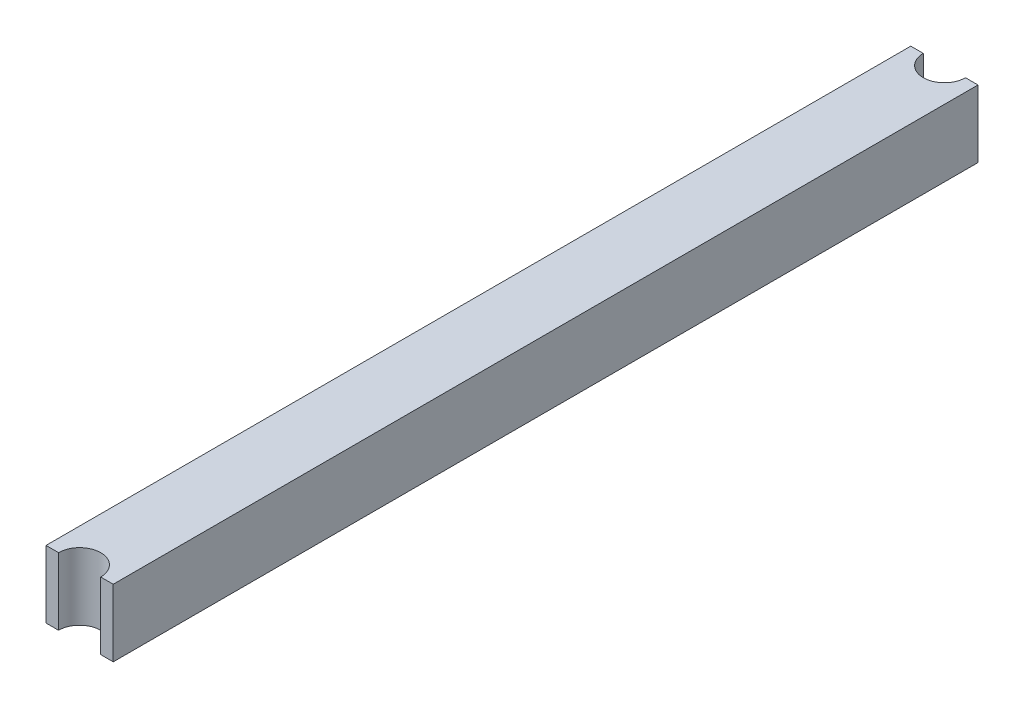
ISO-10303-21;
HEADER;
FILE_DESCRIPTION(('STEP AP214'),'2;1');
FILE_NAME('part.step','',(''),(''),'','','');
FILE_SCHEMA(('AUTOMOTIVE_DESIGN { 1 0 10303 214 1 1 1 1 }'));
ENDSEC;
DATA;
#1=APPLICATION_CONTEXT('core data for automotive mechanical design processes');
#2=APPLICATION_PROTOCOL_DEFINITION('international standard','automotive_design',2000,#1);
#3=PRODUCT_CONTEXT('',#1,'mechanical');
#4=PRODUCT('Part','Part','',(#3));
#5=PRODUCT_RELATED_PRODUCT_CATEGORY('part','',(#4));
#6=PRODUCT_DEFINITION_FORMATION('','',#4);
#7=PRODUCT_DEFINITION_CONTEXT('part definition',#1,'design');
#8=PRODUCT_DEFINITION('design','',#6,#7);
#9=PRODUCT_DEFINITION_SHAPE('','',#8);
#10=(LENGTH_UNIT() NAMED_UNIT(*) SI_UNIT(.MILLI.,.METRE.));
#11=(NAMED_UNIT(*) PLANE_ANGLE_UNIT() SI_UNIT($,.RADIAN.));
#12=(NAMED_UNIT(*) SI_UNIT($,.STERADIAN.) SOLID_ANGLE_UNIT());
#13=UNCERTAINTY_MEASURE_WITH_UNIT(LENGTH_MEASURE(1.E-05),#10,'distance_accuracy_value','');
#14=(GEOMETRIC_REPRESENTATION_CONTEXT(3) GLOBAL_UNCERTAINTY_ASSIGNED_CONTEXT((#13)) GLOBAL_UNIT_ASSIGNED_CONTEXT((#10,
#11,#12)) REPRESENTATION_CONTEXT('',''));
#15=CARTESIAN_POINT('',(0.,0.,0.));
#16=DIRECTION('',(0.,0.,1.));
#17=DIRECTION('',(1.,0.,0.));
#18=AXIS2_PLACEMENT_3D('',#15,#16,#17);
#19=CARTESIAN_POINT('',(0.,0.,400.));
#20=DIRECTION('',(0.,0.,1.));
#21=DIRECTION('',(1.,0.,0.));
#22=AXIS2_PLACEMENT_3D('',#19,#20,#21);
#23=PLANE('',#22);
#24=DIRECTION('',(0.,1.,0.));
#25=VECTOR('',#24,1.);
#26=CARTESIAN_POINT('',(-5.79499999999999,0.,400.));
#27=LINE('',#26,#25);
#28=CARTESIAN_POINT('',(-5.79499999999999,0.,400.));
#29=VERTEX_POINT('',#28);
#30=CARTESIAN_POINT('',(-5.79499999999999,31.1,400.));
#31=VERTEX_POINT('',#30);
#32=EDGE_CURVE('E11',#29,#31,#27,.T.);
#33=ORIENTED_EDGE('',*,*,#32,.F.);
#34=DIRECTION('',(1.,0.,0.));
#35=VECTOR('',#34,1.);
#36=CARTESIAN_POINT('',(-31.1,0.,400.));
#37=LINE('',#36,#35);
#38=CARTESIAN_POINT('',(0.,0.,400.));
#39=VERTEX_POINT('',#38);
#40=EDGE_CURVE('E127',#29,#39,#37,.T.);
#41=ORIENTED_EDGE('',*,*,#40,.T.);
#42=DIRECTION('',(0.,1.,0.));
#43=VECTOR('',#42,1.);
#44=CARTESIAN_POINT('',(0.,31.1,400.));
#45=LINE('',#44,#43);
#46=CARTESIAN_POINT('',(0.,31.1,400.));
#47=VERTEX_POINT('',#46);
#48=EDGE_CURVE('E160',#39,#47,#45,.T.);
#49=ORIENTED_EDGE('',*,*,#48,.T.);
#50=DIRECTION('',(-1.,0.,0.));
#51=VECTOR('',#50,1.);
#52=CARTESIAN_POINT('',(-31.1,31.1,400.));
#53=LINE('',#52,#51);
#54=EDGE_CURVE('E136',#47,#31,#53,.T.);
#55=ORIENTED_EDGE('',*,*,#54,.T.);
#56=EDGE_LOOP('',(#33,#41,#49,#55));
#57=FACE_BOUND('',#56,.T.);
#58=ADVANCED_FACE('F38',(#57),#23,.T.);
#59=CARTESIAN_POINT('',(0.,0.,0.));
#60=DIRECTION('',(0.,0.,1.));
#61=DIRECTION('',(1.,0.,0.));
#62=AXIS2_PLACEMENT_3D('',#59,#60,#61);
#63=PLANE('',#62);
#64=DIRECTION('',(1.,0.,0.));
#65=VECTOR('',#64,1.);
#66=CARTESIAN_POINT('',(-31.1,0.,0.));
#67=LINE('',#66,#65);
#68=CARTESIAN_POINT('',(-5.795,0.,0.));
#69=VERTEX_POINT('',#68);
#70=CARTESIAN_POINT('',(0.,0.,0.));
#71=VERTEX_POINT('',#70);
#72=EDGE_CURVE('E115',#69,#71,#67,.T.);
#73=ORIENTED_EDGE('',*,*,#72,.F.);
#74=DIRECTION('',(0.,1.,0.));
#75=VECTOR('',#74,1.);
#76=CARTESIAN_POINT('',(-5.795,0.,0.));
#77=LINE('',#76,#75);
#78=CARTESIAN_POINT('',(-5.795,31.1,0.));
#79=VERTEX_POINT('',#78);
#80=EDGE_CURVE('E103',#69,#79,#77,.T.);
#81=ORIENTED_EDGE('',*,*,#80,.T.);
#82=DIRECTION('',(-1.,0.,0.));
#83=VECTOR('',#82,1.);
#84=CARTESIAN_POINT('',(-31.1,31.1,0.));
#85=LINE('',#84,#83);
#86=CARTESIAN_POINT('',(0.,31.1,0.));
#87=VERTEX_POINT('',#86);
#88=EDGE_CURVE('E114',#87,#79,#85,.T.);
#89=ORIENTED_EDGE('',*,*,#88,.F.);
#90=DIRECTION('',(0.,1.,0.));
#91=VECTOR('',#90,1.);
#92=CARTESIAN_POINT('',(0.,31.1,0.));
#93=LINE('',#92,#91);
#94=EDGE_CURVE('E129',#71,#87,#93,.T.);
#95=ORIENTED_EDGE('',*,*,#94,.F.);
#96=EDGE_LOOP('',(#73,#81,#89,#95));
#97=FACE_BOUND('',#96,.T.);
#98=ADVANCED_FACE('F112',(#97),#63,.F.);
#99=CARTESIAN_POINT('',(-31.1,31.1,400.));
#100=DIRECTION('',(1.,0.,0.));
#101=DIRECTION('',(0.,1.,0.));
#102=AXIS2_PLACEMENT_3D('',#99,#100,#101);
#103=PLANE('',#102);
#104=DIRECTION('',(0.,-1.,0.));
#105=VECTOR('',#104,1.);
#106=CARTESIAN_POINT('',(-31.1,31.1,0.));
#107=LINE('',#106,#105);
#108=CARTESIAN_POINT('',(-31.1,31.1,0.));
#109=VERTEX_POINT('',#108);
#110=CARTESIAN_POINT('',(-31.1,0.,0.));
#111=VERTEX_POINT('',#110);
#112=EDGE_CURVE('E155',#109,#111,#107,.T.);
#113=ORIENTED_EDGE('',*,*,#112,.T.);
#114=DIRECTION('',(0.,0.,-1.));
#115=VECTOR('',#114,1.);
#116=CARTESIAN_POINT('',(-31.1,0.,400.));
#117=LINE('',#116,#115);
#118=CARTESIAN_POINT('',(-31.1,0.,400.));
#119=VERTEX_POINT('',#118);
#120=EDGE_CURVE('E141',#119,#111,#117,.T.);
#121=ORIENTED_EDGE('',*,*,#120,.F.);
#122=DIRECTION('',(0.,-1.,0.));
#123=VECTOR('',#122,1.);
#124=CARTESIAN_POINT('',(-31.1,31.1,400.));
#125=LINE('',#124,#123);
#126=CARTESIAN_POINT('',(-31.1,31.1,400.));
#127=VERTEX_POINT('',#126);
#128=EDGE_CURVE('E123',#127,#119,#125,.T.);
#129=ORIENTED_EDGE('',*,*,#128,.F.);
#130=DIRECTION('',(0.,0.,-1.));
#131=VECTOR('',#130,1.);
#132=CARTESIAN_POINT('',(-31.1,31.1,400.));
#133=LINE('',#132,#131);
#134=EDGE_CURVE('E133',#127,#109,#133,.T.);
#135=ORIENTED_EDGE('',*,*,#134,.T.);
#136=EDGE_LOOP('',(#113,#121,#129,#135));
#137=FACE_BOUND('',#136,.T.);
#138=ADVANCED_FACE('F40',(#137),#103,.F.);
#139=CARTESIAN_POINT('',(-31.1,0.,400.));
#140=DIRECTION('',(0.,1.,0.));
#141=DIRECTION('',(0.,0.,1.));
#142=AXIS2_PLACEMENT_3D('',#139,#140,#141);
#143=PLANE('',#142);
#144=ORIENTED_EDGE('',*,*,#40,.F.);
#145=CARTESIAN_POINT('',(-15.55,0.,400.));
#146=DIRECTION('',(0.,1.,0.));
#147=DIRECTION('',(0.,0.,1.));
#148=AXIS2_PLACEMENT_3D('',#145,#146,#147);
#149=CIRCLE('',#148,9.75500000000001);
#150=CARTESIAN_POINT('',(-25.305,0.,400.));
#151=VERTEX_POINT('',#150);
#152=EDGE_CURVE('E146',#29,#151,#149,.T.);
#153=ORIENTED_EDGE('',*,*,#152,.T.);
#154=EDGE_CURVE('E153',#119,#151,#37,.T.);
#155=ORIENTED_EDGE('',*,*,#154,.F.);
#156=ORIENTED_EDGE('',*,*,#120,.T.);
#157=CARTESIAN_POINT('',(-25.305,0.,0.));
#158=VERTEX_POINT('',#157);
#159=EDGE_CURVE('E169',#111,#158,#67,.T.);
#160=ORIENTED_EDGE('',*,*,#159,.T.);
#161=CARTESIAN_POINT('',(-15.55,0.,0.));
#162=DIRECTION('',(0.,1.,0.));
#163=DIRECTION('',(0.,0.,1.));
#164=AXIS2_PLACEMENT_3D('',#161,#162,#163);
#165=CIRCLE('',#164,9.755);
#166=EDGE_CURVE('E60',#158,#69,#165,.T.);
#167=ORIENTED_EDGE('',*,*,#166,.T.);
#168=ORIENTED_EDGE('',*,*,#72,.T.);
#169=DIRECTION('',(0.,0.,-1.));
#170=VECTOR('',#169,1.);
#171=CARTESIAN_POINT('',(0.,0.,400.));
#172=LINE('',#171,#170);
#173=EDGE_CURVE('E138',#39,#71,#172,.T.);
#174=ORIENTED_EDGE('',*,*,#173,.F.);
#175=EDGE_LOOP('',(#144,#153,#155,#156,#160,#167,#168,#174));
#176=FACE_BOUND('',#175,.T.);
#177=ADVANCED_FACE('F152',(#176),#143,.F.);
#178=CARTESIAN_POINT('',(0.,31.1,400.));
#179=DIRECTION('',(-1.,0.,0.));
#180=DIRECTION('',(0.,-1.,0.));
#181=AXIS2_PLACEMENT_3D('',#178,#179,#180);
#182=PLANE('',#181);
#183=ORIENTED_EDGE('',*,*,#94,.T.);
#184=DIRECTION('',(0.,0.,-1.));
#185=VECTOR('',#184,1.);
#186=CARTESIAN_POINT('',(0.,31.1,400.));
#187=LINE('',#186,#185);
#188=EDGE_CURVE('E122',#47,#87,#187,.T.);
#189=ORIENTED_EDGE('',*,*,#188,.F.);
#190=ORIENTED_EDGE('',*,*,#48,.F.);
#191=ORIENTED_EDGE('',*,*,#173,.T.);
#192=EDGE_LOOP('',(#183,#189,#190,#191));
#193=FACE_BOUND('',#192,.T.);
#194=ADVANCED_FACE('F173',(#193),#182,.F.);
#195=CARTESIAN_POINT('',(-31.1,31.1,400.));
#196=DIRECTION('',(0.,-1.,0.));
#197=DIRECTION('',(0.,0.,-1.));
#198=AXIS2_PLACEMENT_3D('',#195,#196,#197);
#199=PLANE('',#198);
#200=CARTESIAN_POINT('',(-25.305,31.1,400.));
#201=VERTEX_POINT('',#200);
#202=EDGE_CURVE('E162',#201,#127,#53,.T.);
#203=ORIENTED_EDGE('',*,*,#202,.F.);
#204=CARTESIAN_POINT('',(-15.55,31.1,400.));
#205=DIRECTION('',(0.,1.,0.));
#206=DIRECTION('',(0.,0.,1.));
#207=AXIS2_PLACEMENT_3D('',#204,#205,#206);
#208=CIRCLE('',#207,9.75500000000001);
#209=EDGE_CURVE('E52',#31,#201,#208,.T.);
#210=ORIENTED_EDGE('',*,*,#209,.F.);
#211=ORIENTED_EDGE('',*,*,#54,.F.);
#212=ORIENTED_EDGE('',*,*,#188,.T.);
#213=ORIENTED_EDGE('',*,*,#88,.T.);
#214=CARTESIAN_POINT('',(-15.55,31.1,0.));
#215=DIRECTION('',(0.,1.,0.));
#216=DIRECTION('',(0.,0.,1.));
#217=AXIS2_PLACEMENT_3D('',#214,#215,#216);
#218=CIRCLE('',#217,9.755);
#219=CARTESIAN_POINT('',(-25.305,31.1,0.));
#220=VERTEX_POINT('',#219);
#221=EDGE_CURVE('E100',#220,#79,#218,.T.);
#222=ORIENTED_EDGE('',*,*,#221,.F.);
#223=EDGE_CURVE('E124',#220,#109,#85,.T.);
#224=ORIENTED_EDGE('',*,*,#223,.T.);
#225=ORIENTED_EDGE('',*,*,#134,.F.);
#226=EDGE_LOOP('',(#203,#210,#211,#212,#213,#222,#224,#225));
#227=FACE_BOUND('',#226,.T.);
#228=ADVANCED_FACE('F119',(#227),#199,.F.);
#229=DIRECTION('',(0.,1.,0.));
#230=VECTOR('',#229,1.);
#231=CARTESIAN_POINT('',(-25.305,0.,400.));
#232=LINE('',#231,#230);
#233=EDGE_CURVE('E46',#201,#151,#232,.F.);
#234=ORIENTED_EDGE('',*,*,#233,.F.);
#235=ORIENTED_EDGE('',*,*,#202,.T.);
#236=ORIENTED_EDGE('',*,*,#128,.T.);
#237=ORIENTED_EDGE('',*,*,#154,.T.);
#238=EDGE_LOOP('',(#234,#235,#236,#237));
#239=FACE_BOUND('',#238,.T.);
#240=ADVANCED_FACE('F157',(#239),#23,.T.);
#241=ORIENTED_EDGE('',*,*,#223,.F.);
#242=DIRECTION('',(0.,1.,0.));
#243=VECTOR('',#242,1.);
#244=CARTESIAN_POINT('',(-25.305,0.,0.));
#245=LINE('',#244,#243);
#246=EDGE_CURVE('E104',#220,#158,#245,.F.);
#247=ORIENTED_EDGE('',*,*,#246,.T.);
#248=ORIENTED_EDGE('',*,*,#159,.F.);
#249=ORIENTED_EDGE('',*,*,#112,.F.);
#250=EDGE_LOOP('',(#241,#247,#248,#249));
#251=FACE_BOUND('',#250,.T.);
#252=ADVANCED_FACE('F180',(#251),#63,.F.);
#253=CARTESIAN_POINT('',(-15.55,0.,0.));
#254=DIRECTION('',(0.,1.,0.));
#255=DIRECTION('',(0.,0.,1.));
#256=AXIS2_PLACEMENT_3D('',#253,#254,#255);
#257=CYLINDRICAL_SURFACE('',#256,9.755);
#258=ORIENTED_EDGE('',*,*,#166,.F.);
#259=ORIENTED_EDGE('',*,*,#246,.F.);
#260=ORIENTED_EDGE('',*,*,#221,.T.);
#261=ORIENTED_EDGE('',*,*,#80,.F.);
#262=EDGE_LOOP('',(#258,#259,#260,#261));
#263=FACE_BOUND('',#262,.T.);
#264=ADVANCED_FACE('F102',(#263),#257,.F.);
#265=CARTESIAN_POINT('',(-15.55,0.,400.));
#266=DIRECTION('',(0.,1.,0.));
#267=DIRECTION('',(0.,0.,1.));
#268=AXIS2_PLACEMENT_3D('',#265,#266,#267);
#269=CYLINDRICAL_SURFACE('',#268,9.75500000000001);
#270=ORIENTED_EDGE('',*,*,#32,.T.);
#271=ORIENTED_EDGE('',*,*,#209,.T.);
#272=ORIENTED_EDGE('',*,*,#233,.T.);
#273=ORIENTED_EDGE('',*,*,#152,.F.);
#274=EDGE_LOOP('',(#270,#271,#272,#273));
#275=FACE_BOUND('',#274,.T.);
#276=ADVANCED_FACE('F145',(#275),#269,.F.);
#277=CLOSED_SHELL('',(#58,#98,#138,#177,#194,#228,#240,#252,#264,#276));
#278=MANIFOLD_SOLID_BREP('B2',#277);
#279=ADVANCED_BREP_SHAPE_REPRESENTATION('',(#18,#278),#14);
#280=SHAPE_DEFINITION_REPRESENTATION(#9,#279);
ENDSEC;
END-ISO-10303-21;
